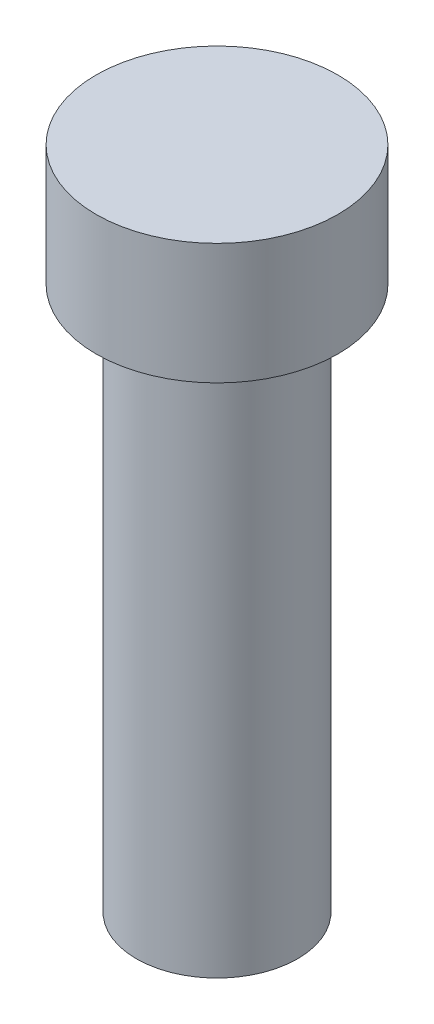
ISO-10303-21;
HEADER;
FILE_DESCRIPTION(('STEP AP214'),'2;1');
FILE_NAME('part.step','',(''),(''),'','','');
FILE_SCHEMA(('AUTOMOTIVE_DESIGN { 1 0 10303 214 1 1 1 1 }'));
ENDSEC;
DATA;
#1=APPLICATION_CONTEXT('core data for automotive mechanical design processes');
#2=APPLICATION_PROTOCOL_DEFINITION('international standard','automotive_design',2000,#1);
#3=PRODUCT_CONTEXT('',#1,'mechanical');
#4=PRODUCT('Part','Part','',(#3));
#5=PRODUCT_RELATED_PRODUCT_CATEGORY('part','',(#4));
#6=PRODUCT_DEFINITION_FORMATION('','',#4);
#7=PRODUCT_DEFINITION_CONTEXT('part definition',#1,'design');
#8=PRODUCT_DEFINITION('design','',#6,#7);
#9=PRODUCT_DEFINITION_SHAPE('','',#8);
#10=(LENGTH_UNIT() NAMED_UNIT(*) SI_UNIT(.MILLI.,.METRE.));
#11=(NAMED_UNIT(*) PLANE_ANGLE_UNIT() SI_UNIT($,.RADIAN.));
#12=(NAMED_UNIT(*) SI_UNIT($,.STERADIAN.) SOLID_ANGLE_UNIT());
#13=UNCERTAINTY_MEASURE_WITH_UNIT(LENGTH_MEASURE(1.E-05),#10,'distance_accuracy_value','');
#14=(GEOMETRIC_REPRESENTATION_CONTEXT(3) GLOBAL_UNCERTAINTY_ASSIGNED_CONTEXT((#13)) GLOBAL_UNIT_ASSIGNED_CONTEXT((#10,
#11,#12)) REPRESENTATION_CONTEXT('',''));
#15=CARTESIAN_POINT('',(0.,0.,0.));
#16=DIRECTION('',(0.,0.,1.));
#17=DIRECTION('',(1.,0.,0.));
#18=AXIS2_PLACEMENT_3D('',#15,#16,#17);
#19=CARTESIAN_POINT('',(0.,3.,0.));
#20=DIRECTION('',(0.,-1.,0.));
#21=DIRECTION('',(0.,0.,-1.));
#22=AXIS2_PLACEMENT_3D('',#19,#20,#21);
#23=CYLINDRICAL_SURFACE('',#22,3.);
#24=CARTESIAN_POINT('',(0.,3.,0.));
#25=DIRECTION('',(0.,1.,0.));
#26=DIRECTION('',(0.,0.,1.));
#27=AXIS2_PLACEMENT_3D('',#24,#25,#26);
#28=CIRCLE('',#27,3.);
#29=CARTESIAN_POINT('',(0.,3.,3.));
#30=VERTEX_POINT('',#29);
#31=EDGE_CURVE('E38',#30,#30,#28,.T.);
#32=ORIENTED_EDGE('',*,*,#31,.F.);
#33=EDGE_LOOP('',(#32));
#34=FACE_BOUND('',#33,.T.);
#35=CARTESIAN_POINT('',(0.,0.,0.));
#36=DIRECTION('',(0.,1.,0.));
#37=DIRECTION('',(0.,0.,1.));
#38=AXIS2_PLACEMENT_3D('',#35,#36,#37);
#39=CIRCLE('',#38,3.);
#40=CARTESIAN_POINT('',(0.,0.,3.));
#41=VERTEX_POINT('',#40);
#42=EDGE_CURVE('E34',#41,#41,#39,.T.);
#43=ORIENTED_EDGE('',*,*,#42,.T.);
#44=EDGE_LOOP('',(#43));
#45=FACE_BOUND('',#44,.T.);
#46=ADVANCED_FACE('F31',(#34,#45),#23,.T.);
#47=CARTESIAN_POINT('',(0.,3.,0.));
#48=DIRECTION('',(0.,1.,0.));
#49=DIRECTION('',(0.,0.,1.));
#50=AXIS2_PLACEMENT_3D('',#47,#48,#49);
#51=PLANE('',#50);
#52=ORIENTED_EDGE('',*,*,#31,.T.);
#53=EDGE_LOOP('',(#52));
#54=FACE_BOUND('',#53,.T.);
#55=ADVANCED_FACE('F55',(#54),#51,.T.);
#56=CARTESIAN_POINT('',(0.,0.,0.));
#57=DIRECTION('',(0.,1.,0.));
#58=DIRECTION('',(0.,0.,1.));
#59=AXIS2_PLACEMENT_3D('',#56,#57,#58);
#60=PLANE('',#59);
#61=CARTESIAN_POINT('',(0.,0.,0.));
#62=DIRECTION('',(0.,-1.,0.));
#63=DIRECTION('',(0.,0.,-1.));
#64=AXIS2_PLACEMENT_3D('',#61,#62,#63);
#65=CIRCLE('',#64,2.);
#66=CARTESIAN_POINT('',(0.,0.,-2.));
#67=VERTEX_POINT('',#66);
#68=EDGE_CURVE('E10',#67,#67,#65,.T.);
#69=ORIENTED_EDGE('',*,*,#68,.F.);
#70=EDGE_LOOP('',(#69));
#71=FACE_BOUND('',#70,.T.);
#72=ORIENTED_EDGE('',*,*,#42,.F.);
#73=EDGE_LOOP('',(#72));
#74=FACE_BOUND('',#73,.T.);
#75=ADVANCED_FACE('F52',(#71,#74),#60,.F.);
#76=CARTESIAN_POINT('',(0.,-13.5,0.));
#77=DIRECTION('',(0.,1.,0.));
#78=DIRECTION('',(0.,0.,1.));
#79=AXIS2_PLACEMENT_3D('',#76,#77,#78);
#80=CYLINDRICAL_SURFACE('',#79,2.);
#81=CARTESIAN_POINT('',(0.,-13.5,0.));
#82=DIRECTION('',(0.,-1.,0.));
#83=DIRECTION('',(0.,0.,-1.));
#84=AXIS2_PLACEMENT_3D('',#81,#82,#83);
#85=CIRCLE('',#84,2.);
#86=CARTESIAN_POINT('',(0.,-13.5,-2.));
#87=VERTEX_POINT('',#86);
#88=EDGE_CURVE('E44',#87,#87,#85,.T.);
#89=ORIENTED_EDGE('',*,*,#88,.F.);
#90=EDGE_LOOP('',(#89));
#91=FACE_BOUND('',#90,.T.);
#92=ORIENTED_EDGE('',*,*,#68,.T.);
#93=EDGE_LOOP('',(#92));
#94=FACE_BOUND('',#93,.T.);
#95=ADVANCED_FACE('F54',(#91,#94),#80,.T.);
#96=CARTESIAN_POINT('',(0.,-13.5,0.));
#97=DIRECTION('',(0.,-1.,0.));
#98=DIRECTION('',(0.,0.,-1.));
#99=AXIS2_PLACEMENT_3D('',#96,#97,#98);
#100=PLANE('',#99);
#101=ORIENTED_EDGE('',*,*,#88,.T.);
#102=EDGE_LOOP('',(#101));
#103=FACE_BOUND('',#102,.T.);
#104=ADVANCED_FACE('F61',(#103),#100,.T.);
#105=CLOSED_SHELL('',(#46,#55,#75,#95,#104));
#106=MANIFOLD_SOLID_BREP('B2',#105);
#107=ADVANCED_BREP_SHAPE_REPRESENTATION('',(#18,#106),#14);
#108=SHAPE_DEFINITION_REPRESENTATION(#9,#107);
ENDSEC;
END-ISO-10303-21;
